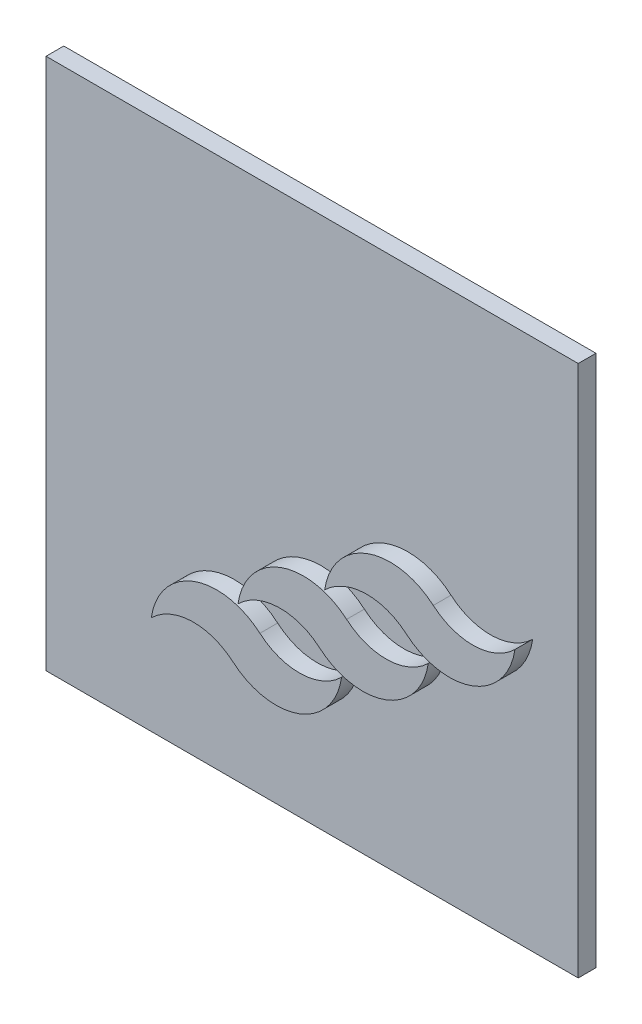
ISO-10303-21;
HEADER;
FILE_DESCRIPTION(('STEP AP214'),'2;1');
FILE_NAME('part.step','',(''),(''),'','','');
FILE_SCHEMA(('AUTOMOTIVE_DESIGN { 1 0 10303 214 1 1 1 1 }'));
ENDSEC;
DATA;
#1=APPLICATION_CONTEXT('core data for automotive mechanical design processes');
#2=APPLICATION_PROTOCOL_DEFINITION('international standard','automotive_design',2000,#1);
#3=PRODUCT_CONTEXT('',#1,'mechanical');
#4=PRODUCT('Part','Part','',(#3));
#5=PRODUCT_RELATED_PRODUCT_CATEGORY('part','',(#4));
#6=PRODUCT_DEFINITION_FORMATION('','',#4);
#7=PRODUCT_DEFINITION_CONTEXT('part definition',#1,'design');
#8=PRODUCT_DEFINITION('design','',#6,#7);
#9=PRODUCT_DEFINITION_SHAPE('','',#8);
#10=(LENGTH_UNIT() NAMED_UNIT(*) SI_UNIT(.MILLI.,.METRE.));
#11=(NAMED_UNIT(*) PLANE_ANGLE_UNIT() SI_UNIT($,.RADIAN.));
#12=(NAMED_UNIT(*) SI_UNIT($,.STERADIAN.) SOLID_ANGLE_UNIT());
#13=UNCERTAINTY_MEASURE_WITH_UNIT(LENGTH_MEASURE(1.E-05),#10,'distance_accuracy_value','');
#14=(GEOMETRIC_REPRESENTATION_CONTEXT(3) GLOBAL_UNCERTAINTY_ASSIGNED_CONTEXT((#13)) GLOBAL_UNIT_ASSIGNED_CONTEXT((#10,
#11,#12)) REPRESENTATION_CONTEXT('',''));
#15=CARTESIAN_POINT('',(0.,0.,0.));
#16=DIRECTION('',(0.,0.,1.));
#17=DIRECTION('',(1.,0.,0.));
#18=AXIS2_PLACEMENT_3D('',#15,#16,#17);
#19=CARTESIAN_POINT('',(0.,0.,10.));
#20=DIRECTION('',(0.,0.,-1.));
#21=DIRECTION('',(-1.,0.,0.));
#22=AXIS2_PLACEMENT_3D('',#19,#20,#21);
#23=PLANE('',#22);
#24=CARTESIAN_POINT('',(250.504460989049,176.802123184969,10.));
#25=DIRECTION('',(0.,0.,-1.));
#26=DIRECTION('',(1.,0.,0.));
#27=AXIS2_PLACEMENT_3D('',#24,#25,#26);
#28=CIRCLE('',#27,34.0058100788832);
#29=CARTESIAN_POINT('',(274.312171430479,152.520689070443,10.));
#30=VERTEX_POINT('',#29);
#31=CARTESIAN_POINT('',(228.305941519881,151.041283670349,10.));
#32=VERTEX_POINT('',#31);
#33=EDGE_CURVE('E157',#30,#32,#28,.T.);
#34=ORIENTED_EDGE('',*,*,#33,.F.);
#35=CARTESIAN_POINT('',(237.417979045094,157.730256472299,10.));
#36=DIRECTION('',(0.,0.,1.));
#37=DIRECTION('',(1.,0.,0.));
#38=AXIS2_PLACEMENT_3D('',#35,#36,#37);
#39=CIRCLE('',#38,37.2601801429392);
#40=CARTESIAN_POINT('',(213.095052097931,129.504093980609,10.));
#41=VERTEX_POINT('',#40);
#42=EDGE_CURVE('E160',#41,#30,#39,.T.);
#43=ORIENTED_EDGE('',*,*,#42,.F.);
#44=CARTESIAN_POINT('',(190.896532628763,103.743254465989,10.));
#45=DIRECTION('',(0.,0.,-1.));
#46=DIRECTION('',(1.,0.,0.));
#47=AXIS2_PLACEMENT_3D('',#44,#45,#46);
#48=CIRCLE('',#47,34.0058100788833);
#49=CARTESIAN_POINT('',(167.088822187333,128.024688580516,10.));
#50=VERTEX_POINT('',#49);
#51=EDGE_CURVE('E68',#50,#41,#48,.T.);
#52=ORIENTED_EDGE('',*,*,#51,.F.);
#53=CARTESIAN_POINT('',(203.983014572718,122.815121178659,10.));
#54=DIRECTION('',(0.,0.,1.));
#55=DIRECTION('',(1.,0.,0.));
#56=AXIS2_PLACEMENT_3D('',#53,#54,#55);
#57=CIRCLE('',#56,37.2601801429393);
#58=EDGE_CURVE('E63',#32,#50,#57,.T.);
#59=ORIENTED_EDGE('',*,*,#58,.F.);
#60=EDGE_LOOP('',(#34,#43,#52,#59));
#61=FACE_BOUND('',#60,.T.);
#62=CARTESIAN_POINT('',(201.632653237049,145.568384903239,10.));
#63=DIRECTION('',(0.,0.,-1.));
#64=DIRECTION('',(1.,0.,0.));
#65=AXIS2_PLACEMENT_3D('',#62,#63,#64);
#66=CIRCLE('',#65,34.0058100788832);
#67=CARTESIAN_POINT('',(225.440363678479,121.286950788713,10.));
#68=VERTEX_POINT('',#67);
#69=CARTESIAN_POINT('',(179.434133767881,119.807545388619,10.));
#70=VERTEX_POINT('',#69);
#71=EDGE_CURVE('E234',#68,#70,#66,.T.);
#72=ORIENTED_EDGE('',*,*,#71,.F.);
#73=CARTESIAN_POINT('',(188.546171293094,126.496518190569,10.));
#74=DIRECTION('',(0.,0.,1.));
#75=DIRECTION('',(1.,0.,0.));
#76=AXIS2_PLACEMENT_3D('',#73,#74,#75);
#77=CIRCLE('',#76,37.2601801429392);
#78=CARTESIAN_POINT('',(164.223244345932,98.2703556988796,10.));
#79=VERTEX_POINT('',#78);
#80=EDGE_CURVE('E221',#79,#68,#77,.T.);
#81=ORIENTED_EDGE('',*,*,#80,.F.);
#82=CARTESIAN_POINT('',(142.024724876763,72.5095161842595,10.));
#83=DIRECTION('',(0.,0.,-1.));
#84=DIRECTION('',(1.,0.,0.));
#85=AXIS2_PLACEMENT_3D('',#82,#83,#84);
#86=CIRCLE('',#85,34.0058100788833);
#87=CARTESIAN_POINT('',(118.217014435333,96.7909502987863,10.));
#88=VERTEX_POINT('',#87);
#89=EDGE_CURVE('E225',#88,#79,#86,.T.);
#90=ORIENTED_EDGE('',*,*,#89,.F.);
#91=CARTESIAN_POINT('',(155.111206820718,91.5813828969297,10.));
#92=DIRECTION('',(0.,0.,1.));
#93=DIRECTION('',(1.,0.,0.));
#94=AXIS2_PLACEMENT_3D('',#91,#92,#93);
#95=CIRCLE('',#94,37.2601801429393);
#96=EDGE_CURVE('E230',#70,#88,#95,.T.);
#97=ORIENTED_EDGE('',*,*,#96,.F.);
#98=EDGE_LOOP('',(#72,#81,#90,#97));
#99=FACE_BOUND('',#98,.T.);
#100=DIRECTION('',(0.,-1.,0.));
#101=VECTOR('',#100,1.);
#102=CARTESIAN_POINT('',(0.,0.,10.));
#103=LINE('',#102,#101);
#104=CARTESIAN_POINT('',(0.,300.,10.));
#105=VERTEX_POINT('',#104);
#106=CARTESIAN_POINT('',(0.,0.,10.));
#107=VERTEX_POINT('',#106);
#108=EDGE_CURVE('E295',#105,#107,#103,.T.);
#109=ORIENTED_EDGE('',*,*,#108,.T.);
#110=DIRECTION('',(1.,0.,0.));
#111=VECTOR('',#110,1.);
#112=CARTESIAN_POINT('',(0.,0.,10.));
#113=LINE('',#112,#111);
#114=CARTESIAN_POINT('',(300.,0.,10.));
#115=VERTEX_POINT('',#114);
#116=EDGE_CURVE('E299',#107,#115,#113,.T.);
#117=ORIENTED_EDGE('',*,*,#116,.T.);
#118=DIRECTION('',(0.,1.,0.));
#119=VECTOR('',#118,1.);
#120=CARTESIAN_POINT('',(300.,0.,10.));
#121=LINE('',#120,#119);
#122=CARTESIAN_POINT('',(300.,300.,10.));
#123=VERTEX_POINT('',#122);
#124=EDGE_CURVE('E303',#115,#123,#121,.T.);
#125=ORIENTED_EDGE('',*,*,#124,.T.);
#126=DIRECTION('',(-1.,0.,0.));
#127=VECTOR('',#126,1.);
#128=CARTESIAN_POINT('',(0.,300.,10.));
#129=LINE('',#128,#127);
#130=EDGE_CURVE('E306',#123,#105,#129,.T.);
#131=ORIENTED_EDGE('',*,*,#130,.T.);
#132=EDGE_LOOP('',(#109,#117,#125,#131));
#133=FACE_BOUND('',#132,.T.);
#134=CARTESIAN_POINT('',(106.239399068718,60.3476446152,10.));
#135=DIRECTION('',(0.,0.,1.));
#136=DIRECTION('',(1.,0.,0.));
#137=AXIS2_PLACEMENT_3D('',#134,#135,#136);
#138=CIRCLE('',#137,37.2601801429393);
#139=CARTESIAN_POINT('',(130.562326015881,88.5738071068896,10.));
#140=VERTEX_POINT('',#139);
#141=CARTESIAN_POINT('',(69.3452066833332,65.5572120170566,10.));
#142=VERTEX_POINT('',#141);
#143=EDGE_CURVE('E238',#140,#142,#138,.T.);
#144=ORIENTED_EDGE('',*,*,#143,.F.);
#145=CARTESIAN_POINT('',(152.76084548505,114.33464662151,10.));
#146=DIRECTION('',(0.,0.,-1.));
#147=DIRECTION('',(1.,0.,0.));
#148=AXIS2_PLACEMENT_3D('',#145,#146,#147);
#149=CIRCLE('',#148,34.0058100788832);
#150=CARTESIAN_POINT('',(176.56855592648,90.0532125069833,10.));
#151=VERTEX_POINT('',#150);
#152=EDGE_CURVE('E255',#151,#140,#149,.T.);
#153=ORIENTED_EDGE('',*,*,#152,.F.);
#154=CARTESIAN_POINT('',(139.674363541095,95.2627799088395,10.));
#155=DIRECTION('',(0.,0.,1.));
#156=DIRECTION('',(1.,0.,0.));
#157=AXIS2_PLACEMENT_3D('',#154,#155,#156);
#158=CIRCLE('',#157,37.2601801429392);
#159=CARTESIAN_POINT('',(115.351436593932,67.03661741715,10.));
#160=VERTEX_POINT('',#159);
#161=EDGE_CURVE('E272',#160,#151,#158,.T.);
#162=ORIENTED_EDGE('',*,*,#161,.F.);
#163=CARTESIAN_POINT('',(93.1529171247632,41.2757779025298,10.));
#164=DIRECTION('',(0.,0.,-1.));
#165=DIRECTION('',(1.,0.,0.));
#166=AXIS2_PLACEMENT_3D('',#163,#164,#165);
#167=CIRCLE('',#166,34.0058100788833);
#168=EDGE_CURVE('E268',#142,#160,#167,.T.);
#169=ORIENTED_EDGE('',*,*,#168,.F.);
#170=EDGE_LOOP('',(#144,#153,#162,#169));
#171=FACE_BOUND('',#170,.T.);
#172=ADVANCED_FACE('F47',(#61,#99,#133,#171),#23,.F.);
#173=CARTESIAN_POINT('',(0.,0.,10.));
#174=DIRECTION('',(1.,0.,0.));
#175=DIRECTION('',(0.,0.,-1.));
#176=AXIS2_PLACEMENT_3D('',#173,#174,#175);
#177=PLANE('',#176);
#178=DIRECTION('',(0.,-1.,0.));
#179=VECTOR('',#178,1.);
#180=CARTESIAN_POINT('',(0.,0.,0.));
#181=LINE('',#180,#179);
#182=CARTESIAN_POINT('',(0.,300.,0.));
#183=VERTEX_POINT('',#182);
#184=CARTESIAN_POINT('',(0.,0.,0.));
#185=VERTEX_POINT('',#184);
#186=EDGE_CURVE('E294',#183,#185,#181,.T.);
#187=ORIENTED_EDGE('',*,*,#186,.T.);
#188=DIRECTION('',(0.,0.,-1.));
#189=VECTOR('',#188,1.);
#190=CARTESIAN_POINT('',(0.,0.,10.));
#191=LINE('',#190,#189);
#192=EDGE_CURVE('E11',#107,#185,#191,.T.);
#193=ORIENTED_EDGE('',*,*,#192,.F.);
#194=ORIENTED_EDGE('',*,*,#108,.F.);
#195=DIRECTION('',(0.,0.,-1.));
#196=VECTOR('',#195,1.);
#197=CARTESIAN_POINT('',(0.,300.,10.));
#198=LINE('',#197,#196);
#199=EDGE_CURVE('E309',#105,#183,#198,.T.);
#200=ORIENTED_EDGE('',*,*,#199,.T.);
#201=EDGE_LOOP('',(#187,#193,#194,#200));
#202=FACE_BOUND('',#201,.T.);
#203=ADVANCED_FACE('F49',(#202),#177,.F.);
#204=CARTESIAN_POINT('',(0.,0.,10.));
#205=DIRECTION('',(0.,1.,0.));
#206=DIRECTION('',(0.,0.,1.));
#207=AXIS2_PLACEMENT_3D('',#204,#205,#206);
#208=PLANE('',#207);
#209=DIRECTION('',(1.,0.,0.));
#210=VECTOR('',#209,1.);
#211=CARTESIAN_POINT('',(0.,0.,0.));
#212=LINE('',#211,#210);
#213=CARTESIAN_POINT('',(300.,0.,0.));
#214=VERTEX_POINT('',#213);
#215=EDGE_CURVE('E313',#185,#214,#212,.T.);
#216=ORIENTED_EDGE('',*,*,#215,.T.);
#217=DIRECTION('',(0.,0.,-1.));
#218=VECTOR('',#217,1.);
#219=CARTESIAN_POINT('',(300.,0.,10.));
#220=LINE('',#219,#218);
#221=EDGE_CURVE('E56',#115,#214,#220,.T.);
#222=ORIENTED_EDGE('',*,*,#221,.F.);
#223=ORIENTED_EDGE('',*,*,#116,.F.);
#224=ORIENTED_EDGE('',*,*,#192,.T.);
#225=EDGE_LOOP('',(#216,#222,#223,#224));
#226=FACE_BOUND('',#225,.T.);
#227=ADVANCED_FACE('F351',(#226),#208,.F.);
#228=CARTESIAN_POINT('',(300.,0.,10.));
#229=DIRECTION('',(-1.,0.,0.));
#230=DIRECTION('',(0.,0.,1.));
#231=AXIS2_PLACEMENT_3D('',#228,#229,#230);
#232=PLANE('',#231);
#233=DIRECTION('',(0.,1.,0.));
#234=VECTOR('',#233,1.);
#235=CARTESIAN_POINT('',(300.,0.,0.));
#236=LINE('',#235,#234);
#237=CARTESIAN_POINT('',(300.,300.,0.));
#238=VERTEX_POINT('',#237);
#239=EDGE_CURVE('E316',#214,#238,#236,.T.);
#240=ORIENTED_EDGE('',*,*,#239,.T.);
#241=DIRECTION('',(0.,0.,-1.));
#242=VECTOR('',#241,1.);
#243=CARTESIAN_POINT('',(300.,300.,10.));
#244=LINE('',#243,#242);
#245=EDGE_CURVE('E324',#123,#238,#244,.T.);
#246=ORIENTED_EDGE('',*,*,#245,.F.);
#247=ORIENTED_EDGE('',*,*,#124,.F.);
#248=ORIENTED_EDGE('',*,*,#221,.T.);
#249=EDGE_LOOP('',(#240,#246,#247,#248));
#250=FACE_BOUND('',#249,.T.);
#251=ADVANCED_FACE('F335',(#250),#232,.F.);
#252=CARTESIAN_POINT('',(0.,300.,10.));
#253=DIRECTION('',(0.,-1.,0.));
#254=DIRECTION('',(0.,0.,-1.));
#255=AXIS2_PLACEMENT_3D('',#252,#253,#254);
#256=PLANE('',#255);
#257=DIRECTION('',(-1.,0.,0.));
#258=VECTOR('',#257,1.);
#259=CARTESIAN_POINT('',(0.,300.,0.));
#260=LINE('',#259,#258);
#261=EDGE_CURVE('E300',#238,#183,#260,.T.);
#262=ORIENTED_EDGE('',*,*,#261,.T.);
#263=ORIENTED_EDGE('',*,*,#199,.F.);
#264=ORIENTED_EDGE('',*,*,#130,.F.);
#265=ORIENTED_EDGE('',*,*,#245,.T.);
#266=EDGE_LOOP('',(#262,#263,#264,#265));
#267=FACE_BOUND('',#266,.T.);
#268=ADVANCED_FACE('F344',(#267),#256,.F.);
#269=CARTESIAN_POINT('',(0.,0.,0.));
#270=DIRECTION('',(0.,0.,-1.));
#271=DIRECTION('',(-1.,0.,0.));
#272=AXIS2_PLACEMENT_3D('',#269,#270,#271);
#273=PLANE('',#272);
#274=ORIENTED_EDGE('',*,*,#186,.F.);
#275=ORIENTED_EDGE('',*,*,#261,.F.);
#276=ORIENTED_EDGE('',*,*,#239,.F.);
#277=ORIENTED_EDGE('',*,*,#215,.F.);
#278=EDGE_LOOP('',(#274,#275,#276,#277));
#279=FACE_BOUND('',#278,.T.);
#280=ADVANCED_FACE('F341',(#279),#273,.T.);
#281=CARTESIAN_POINT('',(106.239399068718,60.3476446152,20.));
#282=DIRECTION('',(0.,0.,-1.));
#283=DIRECTION('',(-1.,0.,0.));
#284=AXIS2_PLACEMENT_3D('',#281,#282,#283);
#285=CYLINDRICAL_SURFACE('',#284,37.2601801429393);
#286=ORIENTED_EDGE('',*,*,#143,.T.);
#287=DIRECTION('',(0.,0.,-1.));
#288=VECTOR('',#287,1.);
#289=CARTESIAN_POINT('',(69.3452066833332,65.5572120170566,20.));
#290=LINE('',#289,#288);
#291=CARTESIAN_POINT('',(69.3452066833332,65.5572120170566,20.));
#292=VERTEX_POINT('',#291);
#293=EDGE_CURVE('E290',#292,#142,#290,.T.);
#294=ORIENTED_EDGE('',*,*,#293,.F.);
#295=CARTESIAN_POINT('',(106.239399068718,60.3476446152,20.));
#296=DIRECTION('',(0.,0.,1.));
#297=DIRECTION('',(1.,0.,0.));
#298=AXIS2_PLACEMENT_3D('',#295,#296,#297);
#299=CIRCLE('',#298,37.2601801429393);
#300=CARTESIAN_POINT('',(130.562326015881,88.5738071068896,20.));
#301=VERTEX_POINT('',#300);
#302=EDGE_CURVE('E250',#301,#292,#299,.T.);
#303=ORIENTED_EDGE('',*,*,#302,.F.);
#304=DIRECTION('',(0.,0.,-1.));
#305=VECTOR('',#304,1.);
#306=CARTESIAN_POINT('',(130.562326015881,88.5738071068896,20.));
#307=LINE('',#306,#305);
#308=EDGE_CURVE('E264',#301,#140,#307,.T.);
#309=ORIENTED_EDGE('',*,*,#308,.T.);
#310=EDGE_LOOP('',(#286,#294,#303,#309));
#311=FACE_BOUND('',#310,.T.);
#312=ADVANCED_FACE('F366',(#311),#285,.T.);
#313=CARTESIAN_POINT('',(93.1529171247632,41.2757779025298,20.));
#314=DIRECTION('',(0.,0.,-1.));
#315=DIRECTION('',(-1.,0.,0.));
#316=AXIS2_PLACEMENT_3D('',#313,#314,#315);
#317=CYLINDRICAL_SURFACE('',#316,34.0058100788833);
#318=ORIENTED_EDGE('',*,*,#168,.T.);
#319=DIRECTION('',(0.,0.,-1.));
#320=VECTOR('',#319,1.);
#321=CARTESIAN_POINT('',(115.351436593932,67.03661741715,20.));
#322=LINE('',#321,#320);
#323=CARTESIAN_POINT('',(115.351436593932,67.03661741715,20.));
#324=VERTEX_POINT('',#323);
#325=EDGE_CURVE('E286',#324,#160,#322,.T.);
#326=ORIENTED_EDGE('',*,*,#325,.F.);
#327=CARTESIAN_POINT('',(93.1529171247632,41.2757779025298,20.));
#328=DIRECTION('',(0.,0.,-1.));
#329=DIRECTION('',(1.,0.,0.));
#330=AXIS2_PLACEMENT_3D('',#327,#328,#329);
#331=CIRCLE('',#330,34.0058100788833);
#332=EDGE_CURVE('E254',#292,#324,#331,.T.);
#333=ORIENTED_EDGE('',*,*,#332,.F.);
#334=ORIENTED_EDGE('',*,*,#293,.T.);
#335=EDGE_LOOP('',(#318,#326,#333,#334));
#336=FACE_BOUND('',#335,.T.);
#337=ADVANCED_FACE('F392',(#336),#317,.F.);
#338=CARTESIAN_POINT('',(139.674363541095,95.2627799088395,20.));
#339=DIRECTION('',(0.,0.,-1.));
#340=DIRECTION('',(-1.,0.,0.));
#341=AXIS2_PLACEMENT_3D('',#338,#339,#340);
#342=CYLINDRICAL_SURFACE('',#341,37.2601801429392);
#343=ORIENTED_EDGE('',*,*,#161,.T.);
#344=DIRECTION('',(0.,0.,-1.));
#345=VECTOR('',#344,1.);
#346=CARTESIAN_POINT('',(176.56855592648,90.0532125069833,20.));
#347=LINE('',#346,#345);
#348=CARTESIAN_POINT('',(176.56855592648,90.0532125069833,20.));
#349=VERTEX_POINT('',#348);
#350=EDGE_CURVE('E282',#349,#151,#347,.T.);
#351=ORIENTED_EDGE('',*,*,#350,.F.);
#352=CARTESIAN_POINT('',(139.674363541095,95.2627799088395,20.));
#353=DIRECTION('',(0.,0.,1.));
#354=DIRECTION('',(1.,0.,0.));
#355=AXIS2_PLACEMENT_3D('',#352,#353,#354);
#356=CIRCLE('',#355,37.2601801429392);
#357=EDGE_CURVE('E258',#324,#349,#356,.T.);
#358=ORIENTED_EDGE('',*,*,#357,.F.);
#359=ORIENTED_EDGE('',*,*,#325,.T.);
#360=EDGE_LOOP('',(#343,#351,#358,#359));
#361=FACE_BOUND('',#360,.T.);
#362=ADVANCED_FACE('F401',(#361),#342,.T.);
#363=CARTESIAN_POINT('',(152.76084548505,114.33464662151,20.));
#364=DIRECTION('',(0.,0.,-1.));
#365=DIRECTION('',(-1.,0.,0.));
#366=AXIS2_PLACEMENT_3D('',#363,#364,#365);
#367=CYLINDRICAL_SURFACE('',#366,34.0058100788832);
#368=ORIENTED_EDGE('',*,*,#152,.T.);
#369=ORIENTED_EDGE('',*,*,#308,.F.);
#370=CARTESIAN_POINT('',(152.76084548505,114.33464662151,20.));
#371=DIRECTION('',(0.,0.,-1.));
#372=DIRECTION('',(1.,0.,0.));
#373=AXIS2_PLACEMENT_3D('',#370,#371,#372);
#374=CIRCLE('',#373,34.0058100788832);
#375=EDGE_CURVE('E261',#349,#301,#374,.T.);
#376=ORIENTED_EDGE('',*,*,#375,.F.);
#377=ORIENTED_EDGE('',*,*,#350,.T.);
#378=EDGE_LOOP('',(#368,#369,#376,#377));
#379=FACE_BOUND('',#378,.T.);
#380=ADVANCED_FACE('F410',(#379),#367,.F.);
#381=CARTESIAN_POINT('',(99.6961580967408,50.8117112588649,20.));
#382=DIRECTION('',(0.,0.,1.));
#383=DIRECTION('',(1.,0.,0.));
#384=AXIS2_PLACEMENT_3D('',#381,#382,#383);
#385=PLANE('',#384);
#386=ORIENTED_EDGE('',*,*,#302,.T.);
#387=ORIENTED_EDGE('',*,*,#332,.T.);
#388=ORIENTED_EDGE('',*,*,#357,.T.);
#389=ORIENTED_EDGE('',*,*,#375,.T.);
#390=EDGE_LOOP('',(#386,#387,#388,#389));
#391=FACE_BOUND('',#390,.T.);
#392=ADVANCED_FACE('F420',(#391),#385,.T.);
#393=CARTESIAN_POINT('',(201.632653237049,145.568384903239,20.));
#394=DIRECTION('',(0.,0.,-1.));
#395=DIRECTION('',(-1.,0.,0.));
#396=AXIS2_PLACEMENT_3D('',#393,#394,#395);
#397=CYLINDRICAL_SURFACE('',#396,34.0058100788832);
#398=ORIENTED_EDGE('',*,*,#71,.T.);
#399=DIRECTION('',(0.,0.,-1.));
#400=VECTOR('',#399,1.);
#401=CARTESIAN_POINT('',(179.434133767881,119.807545388619,20.));
#402=LINE('',#401,#400);
#403=CARTESIAN_POINT('',(179.434133767881,119.807545388619,20.));
#404=VERTEX_POINT('',#403);
#405=EDGE_CURVE('E165',#404,#70,#402,.T.);
#406=ORIENTED_EDGE('',*,*,#405,.F.);
#407=CARTESIAN_POINT('',(201.632653237049,145.568384903239,20.));
#408=DIRECTION('',(0.,0.,-1.));
#409=DIRECTION('',(1.,0.,0.));
#410=AXIS2_PLACEMENT_3D('',#407,#408,#409);
#411=CIRCLE('',#410,34.0058100788832);
#412=CARTESIAN_POINT('',(225.440363678479,121.286950788713,20.));
#413=VERTEX_POINT('',#412);
#414=EDGE_CURVE('E226',#413,#404,#411,.T.);
#415=ORIENTED_EDGE('',*,*,#414,.F.);
#416=DIRECTION('',(0.,0.,-1.));
#417=VECTOR('',#416,1.);
#418=CARTESIAN_POINT('',(225.440363678479,121.286950788713,20.));
#419=LINE('',#418,#417);
#420=EDGE_CURVE('E216',#413,#68,#419,.T.);
#421=ORIENTED_EDGE('',*,*,#420,.T.);
#422=EDGE_LOOP('',(#398,#406,#415,#421));
#423=FACE_BOUND('',#422,.T.);
#424=ADVANCED_FACE('F430',(#423),#397,.F.);
#425=CARTESIAN_POINT('',(155.111206820718,91.5813828969297,20.));
#426=DIRECTION('',(0.,0.,-1.));
#427=DIRECTION('',(-1.,0.,0.));
#428=AXIS2_PLACEMENT_3D('',#425,#426,#427);
#429=CYLINDRICAL_SURFACE('',#428,37.2601801429393);
#430=ORIENTED_EDGE('',*,*,#96,.T.);
#431=DIRECTION('',(0.,0.,-1.));
#432=VECTOR('',#431,1.);
#433=CARTESIAN_POINT('',(118.217014435333,96.7909502987862,20.));
#434=LINE('',#433,#432);
#435=CARTESIAN_POINT('',(118.217014435333,96.7909502987862,20.));
#436=VERTEX_POINT('',#435);
#437=EDGE_CURVE('E208',#436,#88,#434,.T.);
#438=ORIENTED_EDGE('',*,*,#437,.F.);
#439=CARTESIAN_POINT('',(155.111206820718,91.5813828969297,20.));
#440=DIRECTION('',(0.,0.,1.));
#441=DIRECTION('',(1.,0.,0.));
#442=AXIS2_PLACEMENT_3D('',#439,#440,#441);
#443=CIRCLE('',#442,37.2601801429393);
#444=EDGE_CURVE('E244',#404,#436,#443,.T.);
#445=ORIENTED_EDGE('',*,*,#444,.F.);
#446=ORIENTED_EDGE('',*,*,#405,.T.);
#447=EDGE_LOOP('',(#430,#438,#445,#446));
#448=FACE_BOUND('',#447,.T.);
#449=ADVANCED_FACE('F440',(#448),#429,.T.);
#450=CARTESIAN_POINT('',(142.024724876763,72.5095161842595,20.));
#451=DIRECTION('',(0.,0.,-1.));
#452=DIRECTION('',(-1.,0.,0.));
#453=AXIS2_PLACEMENT_3D('',#450,#451,#452);
#454=CYLINDRICAL_SURFACE('',#453,34.0058100788833);
#455=ORIENTED_EDGE('',*,*,#89,.T.);
#456=DIRECTION('',(0.,0.,-1.));
#457=VECTOR('',#456,1.);
#458=CARTESIAN_POINT('',(164.223244345932,98.2703556988797,20.));
#459=LINE('',#458,#457);
#460=CARTESIAN_POINT('',(164.223244345932,98.2703556988797,20.));
#461=VERTEX_POINT('',#460);
#462=EDGE_CURVE('E212',#461,#79,#459,.T.);
#463=ORIENTED_EDGE('',*,*,#462,.F.);
#464=CARTESIAN_POINT('',(142.024724876763,72.5095161842595,20.));
#465=DIRECTION('',(0.,0.,-1.));
#466=DIRECTION('',(1.,0.,0.));
#467=AXIS2_PLACEMENT_3D('',#464,#465,#466);
#468=CIRCLE('',#467,34.0058100788833);
#469=EDGE_CURVE('E241',#436,#461,#468,.T.);
#470=ORIENTED_EDGE('',*,*,#469,.F.);
#471=ORIENTED_EDGE('',*,*,#437,.T.);
#472=EDGE_LOOP('',(#455,#463,#470,#471));
#473=FACE_BOUND('',#472,.T.);
#474=ADVANCED_FACE('F450',(#473),#454,.F.);
#475=CARTESIAN_POINT('',(188.546171293094,126.496518190569,20.));
#476=DIRECTION('',(0.,0.,-1.));
#477=DIRECTION('',(-1.,0.,0.));
#478=AXIS2_PLACEMENT_3D('',#475,#476,#477);
#479=CYLINDRICAL_SURFACE('',#478,37.2601801429392);
#480=ORIENTED_EDGE('',*,*,#80,.T.);
#481=ORIENTED_EDGE('',*,*,#420,.F.);
#482=CARTESIAN_POINT('',(188.546171293094,126.496518190569,20.));
#483=DIRECTION('',(0.,0.,1.));
#484=DIRECTION('',(1.,0.,0.));
#485=AXIS2_PLACEMENT_3D('',#482,#483,#484);
#486=CIRCLE('',#485,37.2601801429392);
#487=EDGE_CURVE('E220',#461,#413,#486,.T.);
#488=ORIENTED_EDGE('',*,*,#487,.F.);
#489=ORIENTED_EDGE('',*,*,#462,.T.);
#490=EDGE_LOOP('',(#480,#481,#488,#489));
#491=FACE_BOUND('',#490,.T.);
#492=ADVANCED_FACE('F460',(#491),#479,.T.);
#493=CARTESIAN_POINT('',(195.089412265072,136.032451546904,20.));
#494=DIRECTION('',(0.,0.,1.));
#495=DIRECTION('',(1.,0.,0.));
#496=AXIS2_PLACEMENT_3D('',#493,#494,#495);
#497=PLANE('',#496);
#498=ORIENTED_EDGE('',*,*,#414,.T.);
#499=ORIENTED_EDGE('',*,*,#444,.T.);
#500=ORIENTED_EDGE('',*,*,#469,.T.);
#501=ORIENTED_EDGE('',*,*,#487,.T.);
#502=EDGE_LOOP('',(#498,#499,#500,#501));
#503=FACE_BOUND('',#502,.T.);
#504=ADVANCED_FACE('F470',(#503),#497,.T.);
#505=CARTESIAN_POINT('',(250.504460989049,176.802123184969,20.));
#506=DIRECTION('',(0.,0.,-1.));
#507=DIRECTION('',(-1.,0.,0.));
#508=AXIS2_PLACEMENT_3D('',#505,#506,#507);
#509=CYLINDRICAL_SURFACE('',#508,34.0058100788832);
#510=ORIENTED_EDGE('',*,*,#33,.T.);
#511=DIRECTION('',(0.,0.,-1.));
#512=VECTOR('',#511,1.);
#513=CARTESIAN_POINT('',(228.305941519881,151.041283670349,20.));
#514=LINE('',#513,#512);
#515=CARTESIAN_POINT('',(228.305941519881,151.041283670349,20.));
#516=VERTEX_POINT('',#515);
#517=EDGE_CURVE('E530',#516,#32,#514,.T.);
#518=ORIENTED_EDGE('',*,*,#517,.F.);
#519=CARTESIAN_POINT('',(250.504460989049,176.802123184969,20.));
#520=DIRECTION('',(0.,0.,-1.));
#521=DIRECTION('',(1.,0.,0.));
#522=AXIS2_PLACEMENT_3D('',#519,#520,#521);
#523=CIRCLE('',#522,34.0058100788832);
#524=CARTESIAN_POINT('',(274.312171430479,152.520689070443,20.));
#525=VERTEX_POINT('',#524);
#526=EDGE_CURVE('E177',#525,#516,#523,.T.);
#527=ORIENTED_EDGE('',*,*,#526,.F.);
#528=DIRECTION('',(0.,0.,-1.));
#529=VECTOR('',#528,1.);
#530=CARTESIAN_POINT('',(274.312171430479,152.520689070443,20.));
#531=LINE('',#530,#529);
#532=EDGE_CURVE('E172',#525,#30,#531,.T.);
#533=ORIENTED_EDGE('',*,*,#532,.T.);
#534=EDGE_LOOP('',(#510,#518,#527,#533));
#535=FACE_BOUND('',#534,.T.);
#536=ADVANCED_FACE('F179',(#535),#509,.F.);
#537=CARTESIAN_POINT('',(203.983014572718,122.815121178659,20.));
#538=DIRECTION('',(0.,0.,-1.));
#539=DIRECTION('',(-1.,0.,0.));
#540=AXIS2_PLACEMENT_3D('',#537,#538,#539);
#541=CYLINDRICAL_SURFACE('',#540,37.2601801429393);
#542=ORIENTED_EDGE('',*,*,#58,.T.);
#543=DIRECTION('',(0.,0.,-1.));
#544=VECTOR('',#543,1.);
#545=CARTESIAN_POINT('',(167.088822187333,128.024688580516,20.));
#546=LINE('',#545,#544);
#547=CARTESIAN_POINT('',(167.088822187333,128.024688580516,20.));
#548=VERTEX_POINT('',#547);
#549=EDGE_CURVE('E190',#548,#50,#546,.T.);
#550=ORIENTED_EDGE('',*,*,#549,.F.);
#551=CARTESIAN_POINT('',(203.983014572718,122.815121178659,20.));
#552=DIRECTION('',(0.,0.,1.));
#553=DIRECTION('',(1.,0.,0.));
#554=AXIS2_PLACEMENT_3D('',#551,#552,#553);
#555=CIRCLE('',#554,37.2601801429393);
#556=EDGE_CURVE('E200',#516,#548,#555,.T.);
#557=ORIENTED_EDGE('',*,*,#556,.F.);
#558=ORIENTED_EDGE('',*,*,#517,.T.);
#559=EDGE_LOOP('',(#542,#550,#557,#558));
#560=FACE_BOUND('',#559,.T.);
#561=ADVANCED_FACE('F489',(#560),#541,.T.);
#562=CARTESIAN_POINT('',(190.896532628763,103.743254465989,20.));
#563=DIRECTION('',(0.,0.,-1.));
#564=DIRECTION('',(-1.,0.,0.));
#565=AXIS2_PLACEMENT_3D('',#562,#563,#564);
#566=CYLINDRICAL_SURFACE('',#565,34.0058100788833);
#567=ORIENTED_EDGE('',*,*,#51,.T.);
#568=DIRECTION('',(0.,0.,-1.));
#569=VECTOR('',#568,1.);
#570=CARTESIAN_POINT('',(213.095052097931,129.504093980609,20.));
#571=LINE('',#570,#569);
#572=CARTESIAN_POINT('',(213.095052097931,129.504093980609,20.));
#573=VERTEX_POINT('',#572);
#574=EDGE_CURVE('E175',#573,#41,#571,.T.);
#575=ORIENTED_EDGE('',*,*,#574,.F.);
#576=CARTESIAN_POINT('',(190.896532628763,103.743254465989,20.));
#577=DIRECTION('',(0.,0.,-1.));
#578=DIRECTION('',(1.,0.,0.));
#579=AXIS2_PLACEMENT_3D('',#576,#577,#578);
#580=CIRCLE('',#579,34.0058100788833);
#581=EDGE_CURVE('E188',#548,#573,#580,.T.);
#582=ORIENTED_EDGE('',*,*,#581,.F.);
#583=ORIENTED_EDGE('',*,*,#549,.T.);
#584=EDGE_LOOP('',(#567,#575,#582,#583));
#585=FACE_BOUND('',#584,.T.);
#586=ADVANCED_FACE('F498',(#585),#566,.F.);
#587=CARTESIAN_POINT('',(237.417979045094,157.730256472299,20.));
#588=DIRECTION('',(0.,0.,-1.));
#589=DIRECTION('',(-1.,0.,0.));
#590=AXIS2_PLACEMENT_3D('',#587,#588,#589);
#591=CYLINDRICAL_SURFACE('',#590,37.2601801429392);
#592=ORIENTED_EDGE('',*,*,#42,.T.);
#593=ORIENTED_EDGE('',*,*,#532,.F.);
#594=CARTESIAN_POINT('',(237.417979045094,157.730256472299,20.));
#595=DIRECTION('',(0.,0.,1.));
#596=DIRECTION('',(1.,0.,0.));
#597=AXIS2_PLACEMENT_3D('',#594,#595,#596);
#598=CIRCLE('',#597,37.2601801429392);
#599=EDGE_CURVE('E182',#573,#525,#598,.T.);
#600=ORIENTED_EDGE('',*,*,#599,.F.);
#601=ORIENTED_EDGE('',*,*,#574,.T.);
#602=EDGE_LOOP('',(#592,#593,#600,#601));
#603=FACE_BOUND('',#602,.T.);
#604=ADVANCED_FACE('F170',(#603),#591,.T.);
#605=CARTESIAN_POINT('',(243.961220017072,167.266189828634,20.));
#606=DIRECTION('',(0.,0.,1.));
#607=DIRECTION('',(1.,0.,0.));
#608=AXIS2_PLACEMENT_3D('',#605,#606,#607);
#609=PLANE('',#608);
#610=ORIENTED_EDGE('',*,*,#526,.T.);
#611=ORIENTED_EDGE('',*,*,#556,.T.);
#612=ORIENTED_EDGE('',*,*,#581,.T.);
#613=ORIENTED_EDGE('',*,*,#599,.T.);
#614=EDGE_LOOP('',(#610,#611,#612,#613));
#615=FACE_BOUND('',#614,.T.);
#616=ADVANCED_FACE('F517',(#615),#609,.T.);
#617=CLOSED_SHELL('',(#172,#203,#227,#251,#268,#280,#312,#337,#362,#380,#392,#424,#449,#474,
#492,#504,#536,#561,#586,#604,#616));
#618=MANIFOLD_SOLID_BREP('B2',#617);
#619=ADVANCED_BREP_SHAPE_REPRESENTATION('',(#18,#618),#14);
#620=SHAPE_DEFINITION_REPRESENTATION(#9,#619);
ENDSEC;
END-ISO-10303-21;
